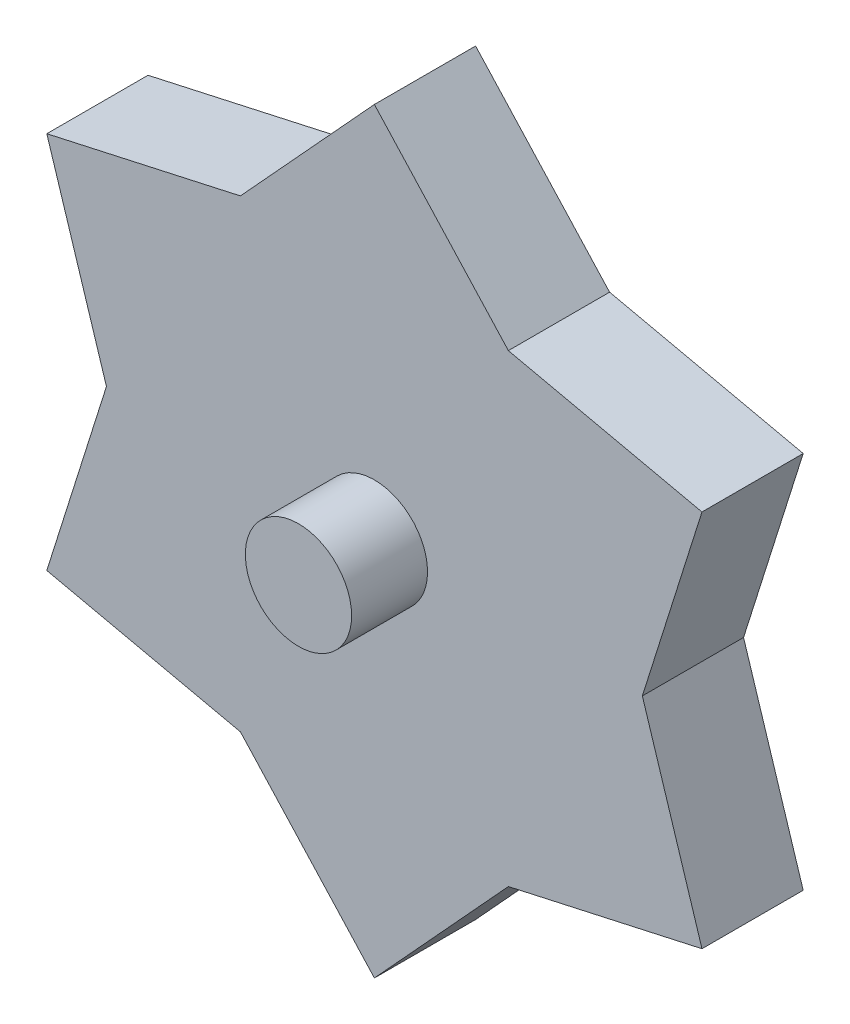
ISO-10303-21;
HEADER;
FILE_DESCRIPTION(('STEP AP214'),'2;1');
FILE_NAME('part.step','',(''),(''),'','','');
FILE_SCHEMA(('AUTOMOTIVE_DESIGN { 1 0 10303 214 1 1 1 1 }'));
ENDSEC;
DATA;
#1=APPLICATION_CONTEXT('core data for automotive mechanical design processes');
#2=APPLICATION_PROTOCOL_DEFINITION('international standard','automotive_design',2000,#1);
#3=PRODUCT_CONTEXT('',#1,'mechanical');
#4=PRODUCT('Part','Part','',(#3));
#5=PRODUCT_RELATED_PRODUCT_CATEGORY('part','',(#4));
#6=PRODUCT_DEFINITION_FORMATION('','',#4);
#7=PRODUCT_DEFINITION_CONTEXT('part definition',#1,'design');
#8=PRODUCT_DEFINITION('design','',#6,#7);
#9=PRODUCT_DEFINITION_SHAPE('','',#8);
#10=(LENGTH_UNIT() NAMED_UNIT(*) SI_UNIT(.MILLI.,.METRE.));
#11=(NAMED_UNIT(*) PLANE_ANGLE_UNIT() SI_UNIT($,.RADIAN.));
#12=(NAMED_UNIT(*) SI_UNIT($,.STERADIAN.) SOLID_ANGLE_UNIT());
#13=UNCERTAINTY_MEASURE_WITH_UNIT(LENGTH_MEASURE(1.E-05),#10,'distance_accuracy_value','');
#14=(GEOMETRIC_REPRESENTATION_CONTEXT(3) GLOBAL_UNCERTAINTY_ASSIGNED_CONTEXT((#13)) GLOBAL_UNIT_ASSIGNED_CONTEXT((#10,
#11,#12)) REPRESENTATION_CONTEXT('',''));
#15=CARTESIAN_POINT('',(0.,0.,0.));
#16=DIRECTION('',(0.,0.,1.));
#17=DIRECTION('',(1.,0.,0.));
#18=AXIS2_PLACEMENT_3D('',#15,#16,#17);
#19=CARTESIAN_POINT('',(4.81627060127854,1.51856428749661,-2.));
#20=DIRECTION('',(-0.953716950748225,-0.300705799504278,0.));
#21=DIRECTION('',(0.300705799504278,-0.953716950748225,0.));
#22=AXIS2_PLACEMENT_3D('',#19,#20,#21);
#23=PLANE('',#22);
#24=DIRECTION('',(0.300705799504278,-0.953716950748225,0.));
#25=VECTOR('',#24,1.);
#26=CARTESIAN_POINT('',(4.81627060127854,1.51856428749661,0.));
#27=LINE('',#26,#25);
#28=CARTESIAN_POINT('',(5.29507208196112,0.,0.));
#29=VERTEX_POINT('',#28);
#30=CARTESIAN_POINT('',(6.4734927176438,-3.73747276312873,0.));
#31=VERTEX_POINT('',#30);
#32=EDGE_CURVE('E201',#29,#31,#27,.T.);
#33=ORIENTED_EDGE('',*,*,#32,.T.);
#34=DIRECTION('',(0.,0.,1.));
#35=VECTOR('',#34,1.);
#36=CARTESIAN_POINT('',(6.4734927176438,-3.73747276312873,-2.));
#37=LINE('',#36,#35);
#38=CARTESIAN_POINT('',(6.4734927176438,-3.73747276312873,-2.));
#39=VERTEX_POINT('',#38);
#40=EDGE_CURVE('E12',#39,#31,#37,.T.);
#41=ORIENTED_EDGE('',*,*,#40,.F.);
#42=DIRECTION('',(0.300705799504278,-0.953716950748225,0.));
#43=VECTOR('',#42,1.);
#44=CARTESIAN_POINT('',(4.81627060127854,1.51856428749661,-2.));
#45=LINE('',#44,#43);
#46=CARTESIAN_POINT('',(5.29507208196112,0.,-2.));
#47=VERTEX_POINT('',#46);
#48=EDGE_CURVE('E224',#47,#39,#45,.T.);
#49=ORIENTED_EDGE('',*,*,#48,.F.);
#50=DIRECTION('',(0.,0.,1.));
#51=VECTOR('',#50,1.);
#52=CARTESIAN_POINT('',(5.29507208196112,0.,-2.));
#53=LINE('',#52,#51);
#54=EDGE_CURVE('E85',#47,#29,#53,.T.);
#55=ORIENTED_EDGE('',*,*,#54,.T.);
#56=EDGE_LOOP('',(#33,#41,#49,#55));
#57=FACE_BOUND('',#56,.T.);
#58=ADVANCED_FACE('F82',(#57),#23,.F.);
#59=CARTESIAN_POINT('',(1.09302005038743,-4.9302948359557,-2.));
#60=DIRECTION('',(-0.216439613938104,0.976296007119933,0.));
#61=DIRECTION('',(-0.976296007119933,-0.216439613938104,0.));
#62=AXIS2_PLACEMENT_3D('',#59,#60,#61);
#63=PLANE('',#62);
#64=DIRECTION('',(-0.976296007119933,-0.216439613938104,0.));
#65=VECTOR('',#64,1.);
#66=CARTESIAN_POINT('',(1.09302005038743,-4.9302948359557,0.));
#67=LINE('',#66,#65);
#68=CARTESIAN_POINT('',(2.64753604098052,-4.58566693784811,0.));
#69=VERTEX_POINT('',#68);
#70=EDGE_CURVE('E137',#31,#69,#67,.T.);
#71=ORIENTED_EDGE('',*,*,#70,.T.);
#72=DIRECTION('',(0.,0.,1.));
#73=VECTOR('',#72,1.);
#74=CARTESIAN_POINT('',(2.64753604098052,-4.58566693784811,-2.));
#75=LINE('',#74,#73);
#76=CARTESIAN_POINT('',(2.64753604098052,-4.58566693784811,-2.));
#77=VERTEX_POINT('',#76);
#78=EDGE_CURVE('E91',#77,#69,#75,.T.);
#79=ORIENTED_EDGE('',*,*,#78,.F.);
#80=DIRECTION('',(-0.976296007119933,-0.216439613938104,0.));
#81=VECTOR('',#80,1.);
#82=CARTESIAN_POINT('',(1.09302005038743,-4.9302948359557,-2.));
#83=LINE('',#82,#81);
#84=EDGE_CURVE('E99',#39,#77,#83,.T.);
#85=ORIENTED_EDGE('',*,*,#84,.F.);
#86=ORIENTED_EDGE('',*,*,#40,.T.);
#87=EDGE_LOOP('',(#71,#79,#85,#86));
#88=FACE_BOUND('',#87,.T.);
#89=ADVANCED_FACE('F269',(#88),#63,.F.);
#90=CARTESIAN_POINT('',(3.72325055089115,-3.41173054845907,-2.));
#91=DIRECTION('',(-0.737277336810128,0.675590207615656,0.));
#92=DIRECTION('',(-0.675590207615656,-0.737277336810128,0.));
#93=AXIS2_PLACEMENT_3D('',#90,#91,#92);
#94=PLANE('',#93);
#95=DIRECTION('',(-0.675590207615656,-0.737277336810128,0.));
#96=VECTOR('',#95,1.);
#97=CARTESIAN_POINT('',(3.72325055089115,-3.41173054845907,0.));
#98=LINE('',#97,#96);
#99=CARTESIAN_POINT('',(0.,-7.47494552625746,0.));
#100=VERTEX_POINT('',#99);
#101=EDGE_CURVE('E186',#69,#100,#98,.T.);
#102=ORIENTED_EDGE('',*,*,#101,.T.);
#103=DIRECTION('',(0.,0.,1.));
#104=VECTOR('',#103,1.);
#105=CARTESIAN_POINT('',(0.,-7.47494552625746,-2.));
#106=LINE('',#105,#104);
#107=CARTESIAN_POINT('',(0.,-7.47494552625746,-2.));
#108=VERTEX_POINT('',#107);
#109=EDGE_CURVE('E184',#108,#100,#106,.T.);
#110=ORIENTED_EDGE('',*,*,#109,.F.);
#111=DIRECTION('',(-0.675590207615656,-0.737277336810128,0.));
#112=VECTOR('',#111,1.);
#113=CARTESIAN_POINT('',(3.72325055089115,-3.41173054845907,-2.));
#114=LINE('',#113,#112);
#115=EDGE_CURVE('E175',#77,#108,#114,.T.);
#116=ORIENTED_EDGE('',*,*,#115,.F.);
#117=ORIENTED_EDGE('',*,*,#78,.T.);
#118=EDGE_LOOP('',(#102,#110,#116,#117));
#119=FACE_BOUND('',#118,.T.);
#120=ADVANCED_FACE('F185',(#119),#94,.F.);
#121=CARTESIAN_POINT('',(-3.72325055089115,-3.41173054845911,-2.));
#122=DIRECTION('',(0.737277336810123,0.675590207615661,0.));
#123=DIRECTION('',(-0.675590207615661,0.737277336810123,0.));
#124=AXIS2_PLACEMENT_3D('',#121,#122,#123);
#125=PLANE('',#124);
#126=DIRECTION('',(-0.675590207615661,0.737277336810123,0.));
#127=VECTOR('',#126,1.);
#128=CARTESIAN_POINT('',(-3.72325055089115,-3.41173054845911,0.));
#129=LINE('',#128,#127);
#130=CARTESIAN_POINT('',(-2.64753604098059,-4.58566693784807,0.));
#131=VERTEX_POINT('',#130);
#132=EDGE_CURVE('E221',#100,#131,#129,.T.);
#133=ORIENTED_EDGE('',*,*,#132,.T.);
#134=DIRECTION('',(0.,0.,1.));
#135=VECTOR('',#134,1.);
#136=CARTESIAN_POINT('',(-2.64753604098059,-4.58566693784807,-2.));
#137=LINE('',#136,#135);
#138=CARTESIAN_POINT('',(-2.64753604098059,-4.58566693784807,-2.));
#139=VERTEX_POINT('',#138);
#140=EDGE_CURVE('E189',#139,#131,#137,.T.);
#141=ORIENTED_EDGE('',*,*,#140,.F.);
#142=DIRECTION('',(-0.675590207615661,0.737277336810123,0.));
#143=VECTOR('',#142,1.);
#144=CARTESIAN_POINT('',(-3.72325055089115,-3.41173054845911,-2.));
#145=LINE('',#144,#143);
#146=EDGE_CURVE('E179',#108,#139,#145,.T.);
#147=ORIENTED_EDGE('',*,*,#146,.F.);
#148=ORIENTED_EDGE('',*,*,#109,.T.);
#149=EDGE_LOOP('',(#133,#141,#147,#148));
#150=FACE_BOUND('',#149,.T.);
#151=ADVANCED_FACE('F191',(#150),#125,.F.);
#152=CARTESIAN_POINT('',(-1.09302005038739,-4.93029483595567,-2.));
#153=DIRECTION('',(0.216439613938097,0.976296007119935,0.));
#154=DIRECTION('',(-0.976296007119935,0.216439613938097,0.));
#155=AXIS2_PLACEMENT_3D('',#152,#153,#154);
#156=PLANE('',#155);
#157=DIRECTION('',(-0.976296007119935,0.216439613938097,0.));
#158=VECTOR('',#157,1.);
#159=CARTESIAN_POINT('',(-1.09302005038739,-4.93029483595567,0.));
#160=LINE('',#159,#158);
#161=CARTESIAN_POINT('',(-6.4734927176438,-3.73747276312873,0.));
#162=VERTEX_POINT('',#161);
#163=EDGE_CURVE('E219',#131,#162,#160,.T.);
#164=ORIENTED_EDGE('',*,*,#163,.T.);
#165=DIRECTION('',(0.,0.,1.));
#166=VECTOR('',#165,1.);
#167=CARTESIAN_POINT('',(-6.4734927176438,-3.73747276312873,-2.));
#168=LINE('',#167,#166);
#169=CARTESIAN_POINT('',(-6.4734927176438,-3.73747276312873,-2.));
#170=VERTEX_POINT('',#169);
#171=EDGE_CURVE('E228',#170,#162,#168,.T.);
#172=ORIENTED_EDGE('',*,*,#171,.F.);
#173=DIRECTION('',(-0.976296007119935,0.216439613938097,0.));
#174=VECTOR('',#173,1.);
#175=CARTESIAN_POINT('',(-1.09302005038739,-4.93029483595567,-2.));
#176=LINE('',#175,#174);
#177=EDGE_CURVE('E194',#139,#170,#176,.T.);
#178=ORIENTED_EDGE('',*,*,#177,.F.);
#179=ORIENTED_EDGE('',*,*,#140,.T.);
#180=EDGE_LOOP('',(#164,#172,#178,#179));
#181=FACE_BOUND('',#180,.T.);
#182=ADVANCED_FACE('F282',(#181),#156,.F.);
#183=CARTESIAN_POINT('',(-4.81627060127858,1.51856428749658,-2.));
#184=DIRECTION('',(0.953716950748227,-0.300705799504272,0.));
#185=DIRECTION('',(0.300705799504272,0.953716950748227,0.));
#186=AXIS2_PLACEMENT_3D('',#183,#184,#185);
#187=PLANE('',#186);
#188=DIRECTION('',(0.300705799504272,0.953716950748227,0.));
#189=VECTOR('',#188,1.);
#190=CARTESIAN_POINT('',(-4.81627060127858,1.51856428749658,0.));
#191=LINE('',#190,#189);
#192=CARTESIAN_POINT('',(-5.29507208196112,0.,0.));
#193=VERTEX_POINT('',#192);
#194=EDGE_CURVE('E217',#162,#193,#191,.T.);
#195=ORIENTED_EDGE('',*,*,#194,.T.);
#196=DIRECTION('',(0.,0.,1.));
#197=VECTOR('',#196,1.);
#198=CARTESIAN_POINT('',(-5.29507208196112,0.,-2.));
#199=LINE('',#198,#197);
#200=CARTESIAN_POINT('',(-5.29507208196112,0.,-2.));
#201=VERTEX_POINT('',#200);
#202=EDGE_CURVE('E231',#201,#193,#199,.T.);
#203=ORIENTED_EDGE('',*,*,#202,.F.);
#204=DIRECTION('',(0.300705799504272,0.953716950748227,0.));
#205=VECTOR('',#204,1.);
#206=CARTESIAN_POINT('',(-4.81627060127858,1.51856428749658,-2.));
#207=LINE('',#206,#205);
#208=EDGE_CURVE('E196',#170,#201,#207,.T.);
#209=ORIENTED_EDGE('',*,*,#208,.F.);
#210=ORIENTED_EDGE('',*,*,#171,.T.);
#211=EDGE_LOOP('',(#195,#203,#209,#210));
#212=FACE_BOUND('',#211,.T.);
#213=ADVANCED_FACE('F285',(#212),#187,.F.);
#214=CARTESIAN_POINT('',(-4.81627060127854,-1.51856428749661,-2.));
#215=DIRECTION('',(0.953716950748225,0.300705799504278,0.));
#216=DIRECTION('',(-0.300705799504278,0.953716950748225,0.));
#217=AXIS2_PLACEMENT_3D('',#214,#215,#216);
#218=PLANE('',#217);
#219=DIRECTION('',(-0.300705799504278,0.953716950748225,0.));
#220=VECTOR('',#219,1.);
#221=CARTESIAN_POINT('',(-4.81627060127854,-1.51856428749661,0.));
#222=LINE('',#221,#220);
#223=CARTESIAN_POINT('',(-6.4734927176438,3.73747276312873,0.));
#224=VERTEX_POINT('',#223);
#225=EDGE_CURVE('E215',#193,#224,#222,.T.);
#226=ORIENTED_EDGE('',*,*,#225,.T.);
#227=DIRECTION('',(0.,0.,1.));
#228=VECTOR('',#227,1.);
#229=CARTESIAN_POINT('',(-6.4734927176438,3.73747276312873,-2.));
#230=LINE('',#229,#228);
#231=CARTESIAN_POINT('',(-6.4734927176438,3.73747276312873,-2.));
#232=VERTEX_POINT('',#231);
#233=EDGE_CURVE('E234',#232,#224,#230,.T.);
#234=ORIENTED_EDGE('',*,*,#233,.F.);
#235=DIRECTION('',(-0.300705799504278,0.953716950748225,0.));
#236=VECTOR('',#235,1.);
#237=CARTESIAN_POINT('',(-4.81627060127854,-1.51856428749661,-2.));
#238=LINE('',#237,#236);
#239=EDGE_CURVE('E322',#201,#232,#238,.T.);
#240=ORIENTED_EDGE('',*,*,#239,.F.);
#241=ORIENTED_EDGE('',*,*,#202,.T.);
#242=EDGE_LOOP('',(#226,#234,#240,#241));
#243=FACE_BOUND('',#242,.T.);
#244=ADVANCED_FACE('F289',(#243),#218,.F.);
#245=CARTESIAN_POINT('',(-1.09302005038744,4.9302948359557,-2.));
#246=DIRECTION('',(0.216439613938105,-0.976296007119933,0.));
#247=DIRECTION('',(0.976296007119933,0.216439613938105,0.));
#248=AXIS2_PLACEMENT_3D('',#245,#246,#247);
#249=PLANE('',#248);
#250=DIRECTION('',(0.976296007119933,0.216439613938105,0.));
#251=VECTOR('',#250,1.);
#252=CARTESIAN_POINT('',(-1.09302005038744,4.9302948359557,0.));
#253=LINE('',#252,#251);
#254=CARTESIAN_POINT('',(-2.64753604098052,4.5856669378481,0.));
#255=VERTEX_POINT('',#254);
#256=EDGE_CURVE('E213',#224,#255,#253,.T.);
#257=ORIENTED_EDGE('',*,*,#256,.T.);
#258=DIRECTION('',(0.,0.,1.));
#259=VECTOR('',#258,1.);
#260=CARTESIAN_POINT('',(-2.64753604098052,4.5856669378481,-2.));
#261=LINE('',#260,#259);
#262=CARTESIAN_POINT('',(-2.64753604098052,4.5856669378481,-2.));
#263=VERTEX_POINT('',#262);
#264=EDGE_CURVE('E237',#263,#255,#261,.T.);
#265=ORIENTED_EDGE('',*,*,#264,.F.);
#266=DIRECTION('',(0.976296007119933,0.216439613938105,0.));
#267=VECTOR('',#266,1.);
#268=CARTESIAN_POINT('',(-1.09302005038744,4.9302948359557,-2.));
#269=LINE('',#268,#267);
#270=EDGE_CURVE('E320',#232,#263,#269,.T.);
#271=ORIENTED_EDGE('',*,*,#270,.F.);
#272=ORIENTED_EDGE('',*,*,#233,.T.);
#273=EDGE_LOOP('',(#257,#265,#271,#272));
#274=FACE_BOUND('',#273,.T.);
#275=ADVANCED_FACE('F293',(#274),#249,.F.);
#276=CARTESIAN_POINT('',(-3.72325055089115,3.41173054845907,-2.));
#277=DIRECTION('',(0.737277336810128,-0.675590207615657,0.));
#278=DIRECTION('',(0.675590207615657,0.737277336810128,0.));
#279=AXIS2_PLACEMENT_3D('',#276,#277,#278);
#280=PLANE('',#279);
#281=DIRECTION('',(0.675590207615657,0.737277336810128,0.));
#282=VECTOR('',#281,1.);
#283=CARTESIAN_POINT('',(-3.72325055089115,3.41173054845907,0.));
#284=LINE('',#283,#282);
#285=CARTESIAN_POINT('',(0.,7.47494552625746,0.));
#286=VERTEX_POINT('',#285);
#287=EDGE_CURVE('E211',#255,#286,#284,.T.);
#288=ORIENTED_EDGE('',*,*,#287,.T.);
#289=DIRECTION('',(0.,0.,1.));
#290=VECTOR('',#289,1.);
#291=CARTESIAN_POINT('',(0.,7.47494552625746,-2.));
#292=LINE('',#291,#290);
#293=CARTESIAN_POINT('',(0.,7.47494552625746,-2.));
#294=VERTEX_POINT('',#293);
#295=EDGE_CURVE('E240',#294,#286,#292,.T.);
#296=ORIENTED_EDGE('',*,*,#295,.F.);
#297=DIRECTION('',(0.675590207615657,0.737277336810128,0.));
#298=VECTOR('',#297,1.);
#299=CARTESIAN_POINT('',(-3.72325055089115,3.41173054845907,-2.));
#300=LINE('',#299,#298);
#301=EDGE_CURVE('E314',#263,#294,#300,.T.);
#302=ORIENTED_EDGE('',*,*,#301,.F.);
#303=ORIENTED_EDGE('',*,*,#264,.T.);
#304=EDGE_LOOP('',(#288,#296,#302,#303));
#305=FACE_BOUND('',#304,.T.);
#306=ADVANCED_FACE('F297',(#305),#280,.F.);
#307=CARTESIAN_POINT('',(3.72325055089115,3.41173054845911,-2.));
#308=DIRECTION('',(-0.737277336810123,-0.675590207615661,0.));
#309=DIRECTION('',(0.675590207615661,-0.737277336810123,0.));
#310=AXIS2_PLACEMENT_3D('',#307,#308,#309);
#311=PLANE('',#310);
#312=DIRECTION('',(0.675590207615661,-0.737277336810123,0.));
#313=VECTOR('',#312,1.);
#314=CARTESIAN_POINT('',(3.72325055089115,3.41173054845911,0.));
#315=LINE('',#314,#313);
#316=CARTESIAN_POINT('',(2.6475360409806,4.58566693784806,0.));
#317=VERTEX_POINT('',#316);
#318=EDGE_CURVE('E209',#286,#317,#315,.T.);
#319=ORIENTED_EDGE('',*,*,#318,.T.);
#320=DIRECTION('',(0.,0.,1.));
#321=VECTOR('',#320,1.);
#322=CARTESIAN_POINT('',(2.6475360409806,4.58566693784806,-2.));
#323=LINE('',#322,#321);
#324=CARTESIAN_POINT('',(2.6475360409806,4.58566693784806,-2.));
#325=VERTEX_POINT('',#324);
#326=EDGE_CURVE('E243',#325,#317,#323,.T.);
#327=ORIENTED_EDGE('',*,*,#326,.F.);
#328=DIRECTION('',(0.675590207615661,-0.737277336810123,0.));
#329=VECTOR('',#328,1.);
#330=CARTESIAN_POINT('',(3.72325055089115,3.41173054845911,-2.));
#331=LINE('',#330,#329);
#332=EDGE_CURVE('E312',#294,#325,#331,.T.);
#333=ORIENTED_EDGE('',*,*,#332,.F.);
#334=ORIENTED_EDGE('',*,*,#295,.T.);
#335=EDGE_LOOP('',(#319,#327,#333,#334));
#336=FACE_BOUND('',#335,.T.);
#337=ADVANCED_FACE('F265',(#336),#311,.F.);
#338=CARTESIAN_POINT('',(1.09302005038739,4.93029483595567,-2.));
#339=DIRECTION('',(-0.216439613938098,-0.976296007119935,0.));
#340=DIRECTION('',(0.976296007119935,-0.216439613938098,0.));
#341=AXIS2_PLACEMENT_3D('',#338,#339,#340);
#342=PLANE('',#341);
#343=DIRECTION('',(0.976296007119935,-0.216439613938098,0.));
#344=VECTOR('',#343,1.);
#345=CARTESIAN_POINT('',(1.09302005038739,4.93029483595567,0.));
#346=LINE('',#345,#344);
#347=CARTESIAN_POINT('',(6.4734927176438,3.73747276312873,0.));
#348=VERTEX_POINT('',#347);
#349=EDGE_CURVE('E207',#317,#348,#346,.T.);
#350=ORIENTED_EDGE('',*,*,#349,.T.);
#351=DIRECTION('',(0.,0.,1.));
#352=VECTOR('',#351,1.);
#353=CARTESIAN_POINT('',(6.4734927176438,3.73747276312873,-2.));
#354=LINE('',#353,#352);
#355=CARTESIAN_POINT('',(6.4734927176438,3.73747276312873,-2.));
#356=VERTEX_POINT('',#355);
#357=EDGE_CURVE('E245',#356,#348,#354,.T.);
#358=ORIENTED_EDGE('',*,*,#357,.F.);
#359=DIRECTION('',(0.976296007119935,-0.216439613938098,0.));
#360=VECTOR('',#359,1.);
#361=CARTESIAN_POINT('',(1.09302005038739,4.93029483595567,-2.));
#362=LINE('',#361,#360);
#363=EDGE_CURVE('E311',#325,#356,#362,.T.);
#364=ORIENTED_EDGE('',*,*,#363,.F.);
#365=ORIENTED_EDGE('',*,*,#326,.T.);
#366=EDGE_LOOP('',(#350,#358,#364,#365));
#367=FACE_BOUND('',#366,.T.);
#368=ADVANCED_FACE('F259',(#367),#342,.F.);
#369=CARTESIAN_POINT('',(4.81627060127858,-1.51856428749659,-2.));
#370=DIRECTION('',(-0.953716950748227,0.300705799504272,0.));
#371=DIRECTION('',(-0.300705799504272,-0.953716950748227,0.));
#372=AXIS2_PLACEMENT_3D('',#369,#370,#371);
#373=PLANE('',#372);
#374=DIRECTION('',(-0.300705799504272,-0.953716950748227,0.));
#375=VECTOR('',#374,1.);
#376=CARTESIAN_POINT('',(4.81627060127858,-1.51856428749659,0.));
#377=LINE('',#376,#375);
#378=EDGE_CURVE('E204',#348,#29,#377,.T.);
#379=ORIENTED_EDGE('',*,*,#378,.T.);
#380=ORIENTED_EDGE('',*,*,#54,.F.);
#381=DIRECTION('',(-0.300705799504272,-0.953716950748227,0.));
#382=VECTOR('',#381,1.);
#383=CARTESIAN_POINT('',(4.81627060127858,-1.51856428749659,-2.));
#384=LINE('',#383,#382);
#385=EDGE_CURVE('E149',#356,#47,#384,.T.);
#386=ORIENTED_EDGE('',*,*,#385,.F.);
#387=ORIENTED_EDGE('',*,*,#357,.T.);
#388=EDGE_LOOP('',(#379,#380,#386,#387));
#389=FACE_BOUND('',#388,.T.);
#390=ADVANCED_FACE('F257',(#389),#373,.F.);
#391=CARTESIAN_POINT('',(0.,0.,-2.));
#392=DIRECTION('',(0.,0.,1.));
#393=DIRECTION('',(1.,0.,0.));
#394=AXIS2_PLACEMENT_3D('',#391,#392,#393);
#395=PLANE('',#394);
#396=ORIENTED_EDGE('',*,*,#48,.T.);
#397=ORIENTED_EDGE('',*,*,#84,.T.);
#398=ORIENTED_EDGE('',*,*,#115,.T.);
#399=ORIENTED_EDGE('',*,*,#146,.T.);
#400=ORIENTED_EDGE('',*,*,#177,.T.);
#401=ORIENTED_EDGE('',*,*,#208,.T.);
#402=ORIENTED_EDGE('',*,*,#239,.T.);
#403=ORIENTED_EDGE('',*,*,#270,.T.);
#404=ORIENTED_EDGE('',*,*,#301,.T.);
#405=ORIENTED_EDGE('',*,*,#332,.T.);
#406=ORIENTED_EDGE('',*,*,#363,.T.);
#407=ORIENTED_EDGE('',*,*,#385,.T.);
#408=EDGE_LOOP('',(#396,#397,#398,#399,#400,#401,#402,#403,#404,#405,#406,#407));
#409=FACE_BOUND('',#408,.T.);
#410=ADVANCED_FACE('F177',(#409),#395,.F.);
#411=CARTESIAN_POINT('',(0.,0.,0.));
#412=DIRECTION('',(0.,0.,1.));
#413=DIRECTION('',(1.,0.,0.));
#414=AXIS2_PLACEMENT_3D('',#411,#412,#413);
#415=PLANE('',#414);
#416=CARTESIAN_POINT('',(0.,0.,0.));
#417=DIRECTION('',(0.,0.,1.));
#418=DIRECTION('',(1.,0.,0.));
#419=AXIS2_PLACEMENT_3D('',#416,#417,#418);
#420=CIRCLE('',#419,1.05);
#421=CARTESIAN_POINT('',(1.05,0.,0.));
#422=VERTEX_POINT('',#421);
#423=EDGE_CURVE('E336',#422,#422,#420,.T.);
#424=ORIENTED_EDGE('',*,*,#423,.F.);
#425=EDGE_LOOP('',(#424));
#426=FACE_BOUND('',#425,.T.);
#427=ORIENTED_EDGE('',*,*,#32,.F.);
#428=ORIENTED_EDGE('',*,*,#378,.F.);
#429=ORIENTED_EDGE('',*,*,#349,.F.);
#430=ORIENTED_EDGE('',*,*,#318,.F.);
#431=ORIENTED_EDGE('',*,*,#287,.F.);
#432=ORIENTED_EDGE('',*,*,#256,.F.);
#433=ORIENTED_EDGE('',*,*,#225,.F.);
#434=ORIENTED_EDGE('',*,*,#194,.F.);
#435=ORIENTED_EDGE('',*,*,#163,.F.);
#436=ORIENTED_EDGE('',*,*,#132,.F.);
#437=ORIENTED_EDGE('',*,*,#101,.F.);
#438=ORIENTED_EDGE('',*,*,#70,.F.);
#439=EDGE_LOOP('',(#427,#428,#429,#430,#431,#432,#433,#434,#435,#436,#437,#438));
#440=FACE_BOUND('',#439,.T.);
#441=ADVANCED_FACE('F254',(#426,#440),#415,.T.);
#442=CARTESIAN_POINT('',(0.,0.,1.5));
#443=DIRECTION('',(0.,0.,-1.));
#444=DIRECTION('',(-1.,0.,0.));
#445=AXIS2_PLACEMENT_3D('',#442,#443,#444);
#446=CYLINDRICAL_SURFACE('',#445,1.05);
#447=CARTESIAN_POINT('',(0.,0.,1.5));
#448=DIRECTION('',(0.,0.,1.));
#449=DIRECTION('',(1.,0.,0.));
#450=AXIS2_PLACEMENT_3D('',#447,#448,#449);
#451=CIRCLE('',#450,1.05);
#452=CARTESIAN_POINT('',(1.05,0.,1.5));
#453=VERTEX_POINT('',#452);
#454=EDGE_CURVE('E205',#453,#453,#451,.T.);
#455=ORIENTED_EDGE('',*,*,#454,.F.);
#456=EDGE_LOOP('',(#455));
#457=FACE_BOUND('',#456,.T.);
#458=ORIENTED_EDGE('',*,*,#423,.T.);
#459=EDGE_LOOP('',(#458));
#460=FACE_BOUND('',#459,.T.);
#461=ADVANCED_FACE('F344',(#457,#460),#446,.T.);
#462=CARTESIAN_POINT('',(0.,0.,1.5));
#463=DIRECTION('',(0.,0.,1.));
#464=DIRECTION('',(1.,0.,0.));
#465=AXIS2_PLACEMENT_3D('',#462,#463,#464);
#466=PLANE('',#465);
#467=ORIENTED_EDGE('',*,*,#454,.T.);
#468=EDGE_LOOP('',(#467));
#469=FACE_BOUND('',#468,.T.);
#470=ADVANCED_FACE('F342',(#469),#466,.T.);
#471=CLOSED_SHELL('',(#58,#89,#120,#151,#182,#213,#244,#275,#306,#337,#368,#390,#410,#441,#461,#470));
#472=MANIFOLD_SOLID_BREP('B2',#471);
#473=ADVANCED_BREP_SHAPE_REPRESENTATION('',(#18,#472),#14);
#474=SHAPE_DEFINITION_REPRESENTATION(#9,#473);
ENDSEC;
END-ISO-10303-21;
